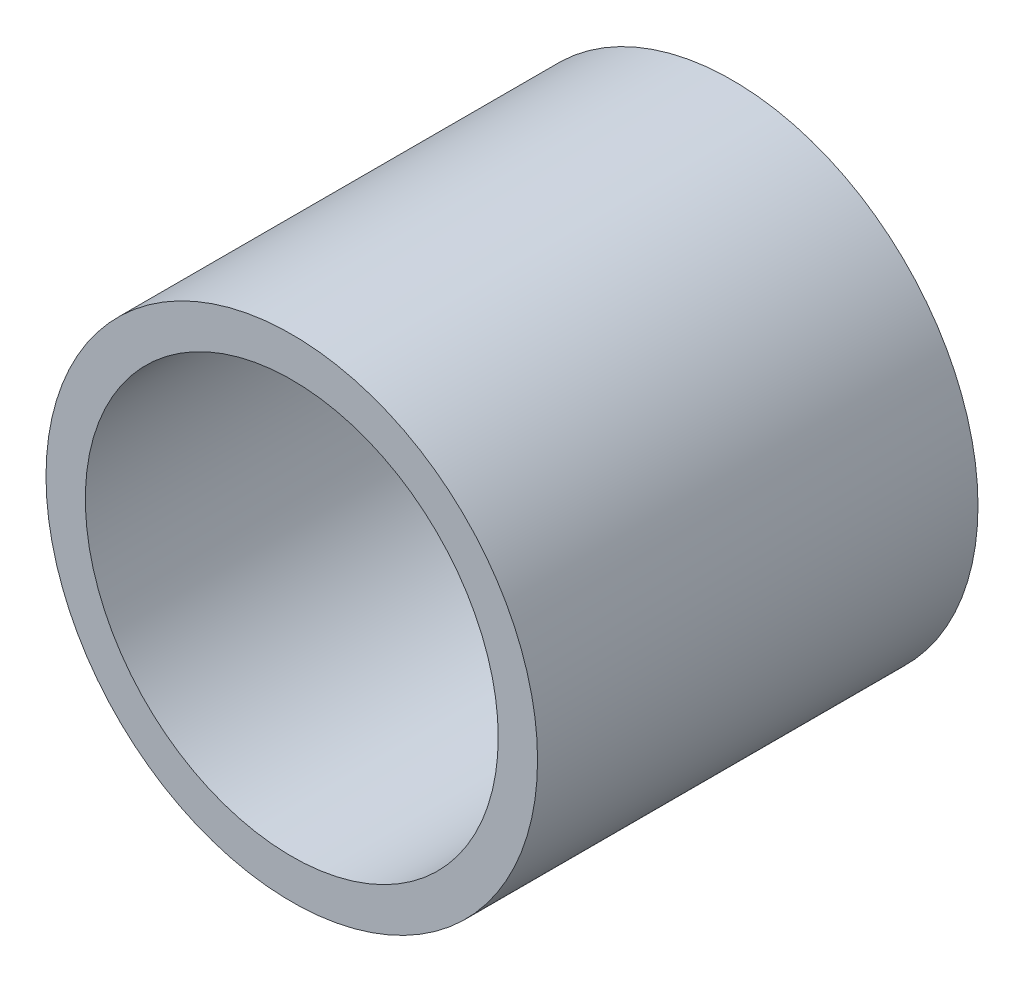
ISO-10303-21;
HEADER;
FILE_DESCRIPTION(('STEP AP214'),'2;1');
FILE_NAME('part.step','',(''),(''),'','','');
FILE_SCHEMA(('AUTOMOTIVE_DESIGN { 1 0 10303 214 1 1 1 1 }'));
ENDSEC;
DATA;
#1=APPLICATION_CONTEXT('core data for automotive mechanical design processes');
#2=APPLICATION_PROTOCOL_DEFINITION('international standard','automotive_design',2000,#1);
#3=PRODUCT_CONTEXT('',#1,'mechanical');
#4=PRODUCT('Part','Part','',(#3));
#5=PRODUCT_RELATED_PRODUCT_CATEGORY('part','',(#4));
#6=PRODUCT_DEFINITION_FORMATION('','',#4);
#7=PRODUCT_DEFINITION_CONTEXT('part definition',#1,'design');
#8=PRODUCT_DEFINITION('design','',#6,#7);
#9=PRODUCT_DEFINITION_SHAPE('','',#8);
#10=(LENGTH_UNIT() NAMED_UNIT(*) SI_UNIT(.MILLI.,.METRE.));
#11=(NAMED_UNIT(*) PLANE_ANGLE_UNIT() SI_UNIT($,.RADIAN.));
#12=(NAMED_UNIT(*) SI_UNIT($,.STERADIAN.) SOLID_ANGLE_UNIT());
#13=UNCERTAINTY_MEASURE_WITH_UNIT(LENGTH_MEASURE(1.E-05),#10,'distance_accuracy_value','');
#14=(GEOMETRIC_REPRESENTATION_CONTEXT(3) GLOBAL_UNCERTAINTY_ASSIGNED_CONTEXT((#13)) GLOBAL_UNIT_ASSIGNED_CONTEXT((#10,
#11,#12)) REPRESENTATION_CONTEXT('',''));
#15=CARTESIAN_POINT('',(0.,0.,0.));
#16=DIRECTION('',(0.,0.,1.));
#17=DIRECTION('',(1.,0.,0.));
#18=AXIS2_PLACEMENT_3D('',#15,#16,#17);
#19=CARTESIAN_POINT('',(0.,0.,28.448));
#20=DIRECTION('',(0.,0.,-1.));
#21=DIRECTION('',(-1.,0.,0.));
#22=AXIS2_PLACEMENT_3D('',#19,#20,#21);
#23=CYLINDRICAL_SURFACE('',#22,15.875);
#24=CARTESIAN_POINT('',(0.,0.,28.448));
#25=DIRECTION('',(0.,0.,1.));
#26=DIRECTION('',(1.,0.,0.));
#27=AXIS2_PLACEMENT_3D('',#24,#25,#26);
#28=CIRCLE('',#27,15.875);
#29=CARTESIAN_POINT('',(15.875,0.,28.448));
#30=VERTEX_POINT('',#29);
#31=EDGE_CURVE('E10',#30,#30,#28,.T.);
#32=ORIENTED_EDGE('',*,*,#31,.F.);
#33=EDGE_LOOP('',(#32));
#34=FACE_BOUND('',#33,.T.);
#35=CARTESIAN_POINT('',(0.,0.,0.));
#36=DIRECTION('',(0.,0.,1.));
#37=DIRECTION('',(1.,0.,0.));
#38=AXIS2_PLACEMENT_3D('',#35,#36,#37);
#39=CIRCLE('',#38,15.875);
#40=CARTESIAN_POINT('',(15.875,0.,0.));
#41=VERTEX_POINT('',#40);
#42=EDGE_CURVE('E36',#41,#41,#39,.T.);
#43=ORIENTED_EDGE('',*,*,#42,.T.);
#44=EDGE_LOOP('',(#43));
#45=FACE_BOUND('',#44,.T.);
#46=ADVANCED_FACE('F33',(#34,#45),#23,.T.);
#47=CARTESIAN_POINT('',(0.,0.,28.448));
#48=DIRECTION('',(0.,0.,1.));
#49=DIRECTION('',(1.,0.,0.));
#50=AXIS2_PLACEMENT_3D('',#47,#48,#49);
#51=PLANE('',#50);
#52=CARTESIAN_POINT('',(0.,0.,28.448));
#53=DIRECTION('',(0.,0.,1.));
#54=DIRECTION('',(1.,0.,0.));
#55=AXIS2_PLACEMENT_3D('',#52,#53,#54);
#56=CIRCLE('',#55,13.335);
#57=CARTESIAN_POINT('',(13.335,0.,28.448));
#58=VERTEX_POINT('',#57);
#59=EDGE_CURVE('E43',#58,#58,#56,.T.);
#60=ORIENTED_EDGE('',*,*,#59,.F.);
#61=EDGE_LOOP('',(#60));
#62=FACE_BOUND('',#61,.T.);
#63=ORIENTED_EDGE('',*,*,#31,.T.);
#64=EDGE_LOOP('',(#63));
#65=FACE_BOUND('',#64,.T.);
#66=ADVANCED_FACE('F63',(#62,#65),#51,.T.);
#67=CARTESIAN_POINT('',(0.,0.,0.));
#68=DIRECTION('',(0.,0.,1.));
#69=DIRECTION('',(1.,0.,0.));
#70=AXIS2_PLACEMENT_3D('',#67,#68,#69);
#71=PLANE('',#70);
#72=ORIENTED_EDGE('',*,*,#42,.F.);
#73=EDGE_LOOP('',(#72));
#74=FACE_BOUND('',#73,.T.);
#75=ADVANCED_FACE('F55',(#74),#71,.F.);
#76=CARTESIAN_POINT('',(0.,0.,28.448));
#77=DIRECTION('',(0.,0.,-1.));
#78=DIRECTION('',(-1.,0.,0.));
#79=AXIS2_PLACEMENT_3D('',#76,#77,#78);
#80=CYLINDRICAL_SURFACE('',#79,13.335);
#81=ORIENTED_EDGE('',*,*,#59,.T.);
#82=EDGE_LOOP('',(#81));
#83=FACE_BOUND('',#82,.T.);
#84=CARTESIAN_POINT('',(0.,0.,2.54));
#85=DIRECTION('',(0.,0.,1.));
#86=DIRECTION('',(1.,0.,0.));
#87=AXIS2_PLACEMENT_3D('',#84,#85,#86);
#88=CIRCLE('',#87,13.335);
#89=CARTESIAN_POINT('',(13.335,0.,2.54));
#90=VERTEX_POINT('',#89);
#91=EDGE_CURVE('E47',#90,#90,#88,.T.);
#92=ORIENTED_EDGE('',*,*,#91,.F.);
#93=EDGE_LOOP('',(#92));
#94=FACE_BOUND('',#93,.T.);
#95=ADVANCED_FACE('F53',(#83,#94),#80,.F.);
#96=CARTESIAN_POINT('',(0.,0.,2.54));
#97=DIRECTION('',(0.,0.,1.));
#98=DIRECTION('',(1.,0.,0.));
#99=AXIS2_PLACEMENT_3D('',#96,#97,#98);
#100=PLANE('',#99);
#101=ORIENTED_EDGE('',*,*,#91,.T.);
#102=EDGE_LOOP('',(#101));
#103=FACE_BOUND('',#102,.T.);
#104=ADVANCED_FACE('F51',(#103),#100,.T.);
#105=CLOSED_SHELL('',(#46,#66,#75,#95,#104));
#106=MANIFOLD_SOLID_BREP('B2',#105);
#107=ADVANCED_BREP_SHAPE_REPRESENTATION('',(#18,#106),#14);
#108=SHAPE_DEFINITION_REPRESENTATION(#9,#107);
ENDSEC;
END-ISO-10303-21;
